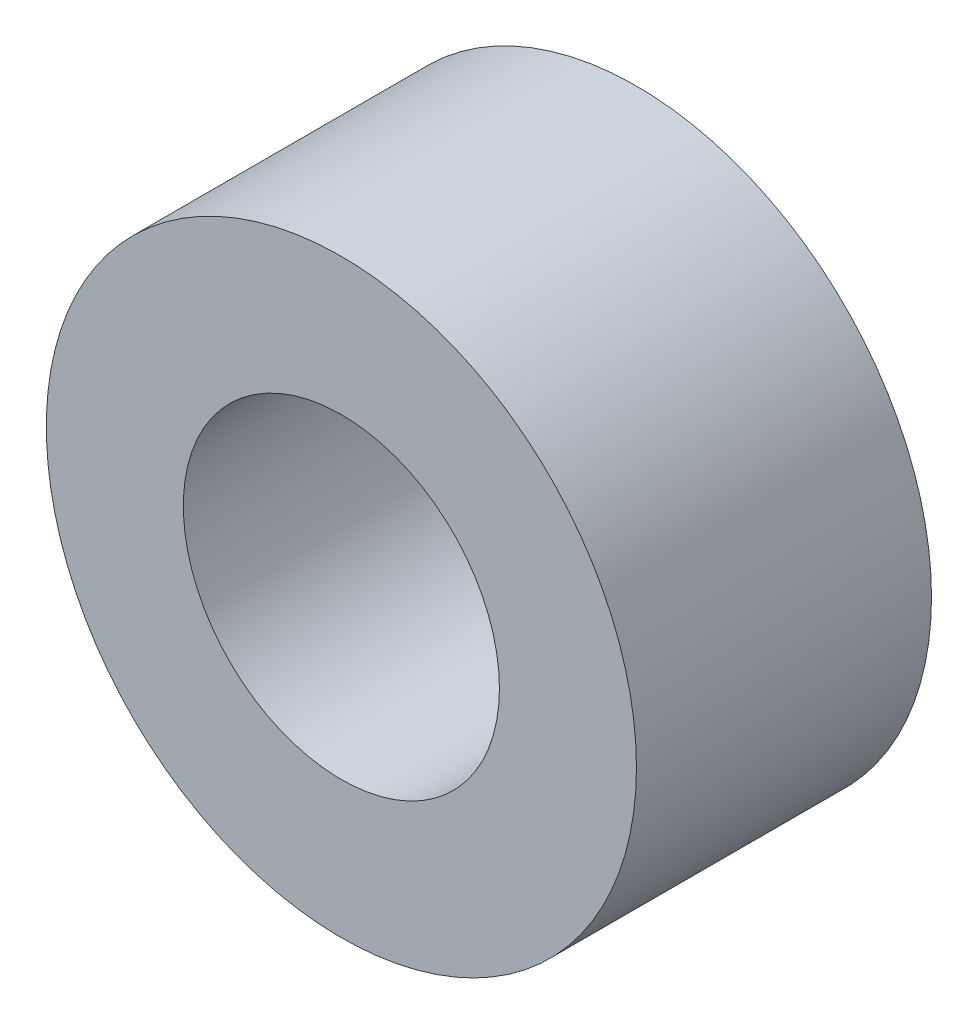
ISO-10303-21;
HEADER;
FILE_DESCRIPTION(('STEP AP214'),'2;1');
FILE_NAME('part.step','',(''),(''),'','','');
FILE_SCHEMA(('AUTOMOTIVE_DESIGN { 1 0 10303 214 1 1 1 1 }'));
ENDSEC;
DATA;
#1=APPLICATION_CONTEXT('core data for automotive mechanical design processes');
#2=APPLICATION_PROTOCOL_DEFINITION('international standard','automotive_design',2000,#1);
#3=PRODUCT_CONTEXT('',#1,'mechanical');
#4=PRODUCT('Part','Part','',(#3));
#5=PRODUCT_RELATED_PRODUCT_CATEGORY('part','',(#4));
#6=PRODUCT_DEFINITION_FORMATION('','',#4);
#7=PRODUCT_DEFINITION_CONTEXT('part definition',#1,'design');
#8=PRODUCT_DEFINITION('design','',#6,#7);
#9=PRODUCT_DEFINITION_SHAPE('','',#8);
#10=(LENGTH_UNIT() NAMED_UNIT(*) SI_UNIT(.MILLI.,.METRE.));
#11=(NAMED_UNIT(*) PLANE_ANGLE_UNIT() SI_UNIT($,.RADIAN.));
#12=(NAMED_UNIT(*) SI_UNIT($,.STERADIAN.) SOLID_ANGLE_UNIT());
#13=UNCERTAINTY_MEASURE_WITH_UNIT(LENGTH_MEASURE(1.E-05),#10,'distance_accuracy_value','');
#14=(GEOMETRIC_REPRESENTATION_CONTEXT(3) GLOBAL_UNCERTAINTY_ASSIGNED_CONTEXT((#13)) GLOBAL_UNIT_ASSIGNED_CONTEXT((#10,
#11,#12)) REPRESENTATION_CONTEXT('',''));
#15=CARTESIAN_POINT('',(0.,0.,0.));
#16=DIRECTION('',(0.,0.,1.));
#17=DIRECTION('',(1.,0.,0.));
#18=AXIS2_PLACEMENT_3D('',#15,#16,#17);
#19=CARTESIAN_POINT('',(0.,0.,4.445));
#20=DIRECTION('',(0.,0.,1.));
#21=DIRECTION('',(1.,0.,0.));
#22=AXIS2_PLACEMENT_3D('',#19,#20,#21);
#23=PLANE('',#22);
#24=CARTESIAN_POINT('',(0.,0.,4.445));
#25=DIRECTION('',(0.,0.,1.));
#26=DIRECTION('',(1.,0.,0.));
#27=AXIS2_PLACEMENT_3D('',#24,#25,#26);
#28=CIRCLE('',#27,8.89);
#29=CARTESIAN_POINT('',(8.89,0.,4.445));
#30=VERTEX_POINT('',#29);
#31=EDGE_CURVE('E10',#30,#30,#28,.T.);
#32=ORIENTED_EDGE('',*,*,#31,.T.);
#33=EDGE_LOOP('',(#32));
#34=FACE_BOUND('',#33,.T.);
#35=CARTESIAN_POINT('',(0.,0.,4.445));
#36=DIRECTION('',(0.,0.,1.));
#37=DIRECTION('',(1.,0.,0.));
#38=AXIS2_PLACEMENT_3D('',#35,#36,#37);
#39=CIRCLE('',#38,4.7625);
#40=CARTESIAN_POINT('',(4.7625,0.,4.445));
#41=VERTEX_POINT('',#40);
#42=EDGE_CURVE('E56',#41,#41,#39,.T.);
#43=ORIENTED_EDGE('',*,*,#42,.F.);
#44=EDGE_LOOP('',(#43));
#45=FACE_BOUND('',#44,.T.);
#46=ADVANCED_FACE('F43',(#34,#45),#23,.T.);
#47=CARTESIAN_POINT('',(0.,0.,-4.445));
#48=DIRECTION('',(0.,0.,1.));
#49=DIRECTION('',(1.,0.,0.));
#50=AXIS2_PLACEMENT_3D('',#47,#48,#49);
#51=PLANE('',#50);
#52=CARTESIAN_POINT('',(0.,0.,-4.445));
#53=DIRECTION('',(0.,0.,1.));
#54=DIRECTION('',(1.,0.,0.));
#55=AXIS2_PLACEMENT_3D('',#52,#53,#54);
#56=CIRCLE('',#55,8.89);
#57=CARTESIAN_POINT('',(8.89,0.,-4.445));
#58=VERTEX_POINT('',#57);
#59=EDGE_CURVE('E47',#58,#58,#56,.T.);
#60=ORIENTED_EDGE('',*,*,#59,.F.);
#61=EDGE_LOOP('',(#60));
#62=FACE_BOUND('',#61,.T.);
#63=CARTESIAN_POINT('',(0.,0.,-4.445));
#64=DIRECTION('',(0.,0.,1.));
#65=DIRECTION('',(1.,0.,0.));
#66=AXIS2_PLACEMENT_3D('',#63,#64,#65);
#67=CIRCLE('',#66,4.7625);
#68=CARTESIAN_POINT('',(4.7625,0.,-4.445));
#69=VERTEX_POINT('',#68);
#70=EDGE_CURVE('E58',#69,#69,#67,.T.);
#71=ORIENTED_EDGE('',*,*,#70,.T.);
#72=EDGE_LOOP('',(#71));
#73=FACE_BOUND('',#72,.T.);
#74=ADVANCED_FACE('F70',(#62,#73),#51,.F.);
#75=CARTESIAN_POINT('',(0.,0.,4.445));
#76=DIRECTION('',(0.,0.,-1.));
#77=DIRECTION('',(-1.,0.,0.));
#78=AXIS2_PLACEMENT_3D('',#75,#76,#77);
#79=CYLINDRICAL_SURFACE('',#78,8.89);
#80=ORIENTED_EDGE('',*,*,#31,.F.);
#81=EDGE_LOOP('',(#80));
#82=FACE_BOUND('',#81,.T.);
#83=ORIENTED_EDGE('',*,*,#59,.T.);
#84=EDGE_LOOP('',(#83));
#85=FACE_BOUND('',#84,.T.);
#86=ADVANCED_FACE('F45',(#82,#85),#79,.T.);
#87=CARTESIAN_POINT('',(0.,0.,4.445));
#88=DIRECTION('',(0.,0.,-1.));
#89=DIRECTION('',(-1.,0.,0.));
#90=AXIS2_PLACEMENT_3D('',#87,#88,#89);
#91=CYLINDRICAL_SURFACE('',#90,4.7625);
#92=ORIENTED_EDGE('',*,*,#42,.T.);
#93=EDGE_LOOP('',(#92));
#94=FACE_BOUND('',#93,.T.);
#95=ORIENTED_EDGE('',*,*,#70,.F.);
#96=EDGE_LOOP('',(#95));
#97=FACE_BOUND('',#96,.T.);
#98=ADVANCED_FACE('F66',(#94,#97),#91,.F.);
#99=CLOSED_SHELL('',(#46,#74,#86,#98));
#100=MANIFOLD_SOLID_BREP('B2',#99);
#101=ADVANCED_BREP_SHAPE_REPRESENTATION('',(#18,#100),#14);
#102=SHAPE_DEFINITION_REPRESENTATION(#9,#101);
ENDSEC;
END-ISO-10303-21;
